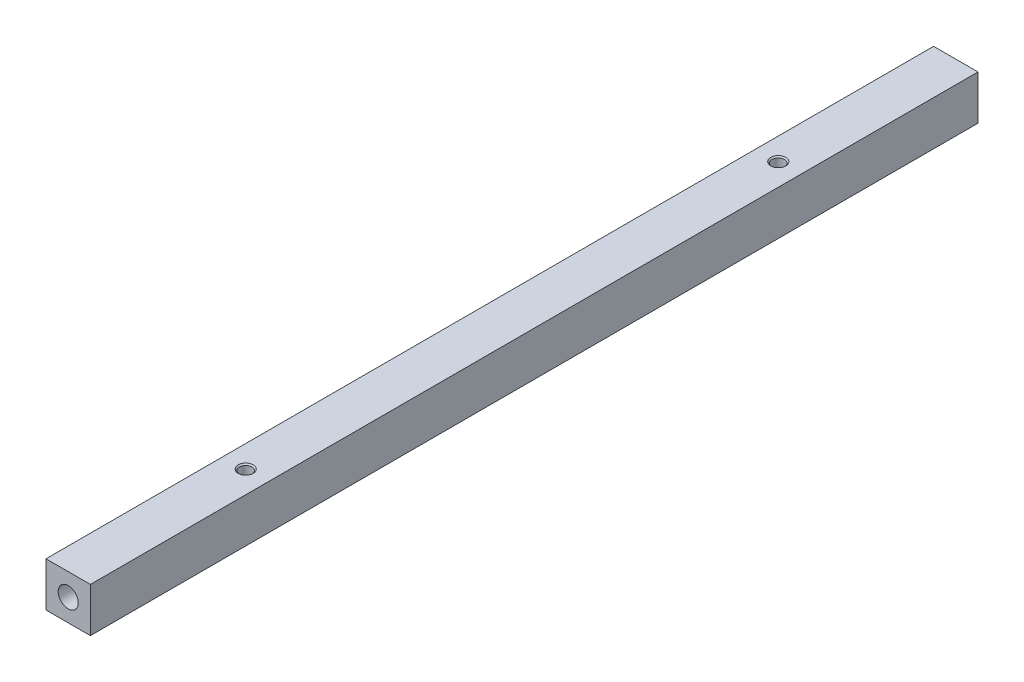
ISO-10303-21;
HEADER;
FILE_DESCRIPTION(('STEP AP214'),'2;1');
FILE_NAME('part.step','',(''),(''),'','','');
FILE_SCHEMA(('AUTOMOTIVE_DESIGN { 1 0 10303 214 1 1 1 1 }'));
ENDSEC;
DATA;
#1=APPLICATION_CONTEXT('core data for automotive mechanical design processes');
#2=APPLICATION_PROTOCOL_DEFINITION('international standard','automotive_design',2000,#1);
#3=PRODUCT_CONTEXT('',#1,'mechanical');
#4=PRODUCT('Part','Part','',(#3));
#5=PRODUCT_RELATED_PRODUCT_CATEGORY('part','',(#4));
#6=PRODUCT_DEFINITION_FORMATION('','',#4);
#7=PRODUCT_DEFINITION_CONTEXT('part definition',#1,'design');
#8=PRODUCT_DEFINITION('design','',#6,#7);
#9=PRODUCT_DEFINITION_SHAPE('','',#8);
#10=(LENGTH_UNIT() NAMED_UNIT(*) SI_UNIT(.MILLI.,.METRE.));
#11=(NAMED_UNIT(*) PLANE_ANGLE_UNIT() SI_UNIT($,.RADIAN.));
#12=(NAMED_UNIT(*) SI_UNIT($,.STERADIAN.) SOLID_ANGLE_UNIT());
#13=UNCERTAINTY_MEASURE_WITH_UNIT(LENGTH_MEASURE(1.E-05),#10,'distance_accuracy_value','');
#14=(GEOMETRIC_REPRESENTATION_CONTEXT(3) GLOBAL_UNCERTAINTY_ASSIGNED_CONTEXT((#13)) GLOBAL_UNIT_ASSIGNED_CONTEXT((#10,
#11,#12)) REPRESENTATION_CONTEXT('',''));
#15=CARTESIAN_POINT('',(0.,0.,0.));
#16=DIRECTION('',(0.,0.,1.));
#17=DIRECTION('',(1.,0.,0.));
#18=AXIS2_PLACEMENT_3D('',#15,#16,#17);
#19=CARTESIAN_POINT('',(7.5,-7.5,150.));
#20=DIRECTION('',(-1.,0.,0.));
#21=DIRECTION('',(0.,0.,1.));
#22=AXIS2_PLACEMENT_3D('',#19,#20,#21);
#23=PLANE('',#22);
#24=DIRECTION('',(0.,1.,0.));
#25=VECTOR('',#24,1.);
#26=CARTESIAN_POINT('',(7.5,-7.5,-150.));
#27=LINE('',#26,#25);
#28=CARTESIAN_POINT('',(7.5,-7.5,-150.));
#29=VERTEX_POINT('',#28);
#30=CARTESIAN_POINT('',(7.5,7.5,-150.));
#31=VERTEX_POINT('',#30);
#32=EDGE_CURVE('E119',#29,#31,#27,.T.);
#33=ORIENTED_EDGE('',*,*,#32,.T.);
#34=DIRECTION('',(0.,0.,-1.));
#35=VECTOR('',#34,1.);
#36=CARTESIAN_POINT('',(7.5,7.5,150.));
#37=LINE('',#36,#35);
#38=CARTESIAN_POINT('',(7.5,7.5,150.));
#39=VERTEX_POINT('',#38);
#40=EDGE_CURVE('E11',#39,#31,#37,.T.);
#41=ORIENTED_EDGE('',*,*,#40,.F.);
#42=DIRECTION('',(0.,1.,0.));
#43=VECTOR('',#42,1.);
#44=CARTESIAN_POINT('',(7.5,-7.5,150.));
#45=LINE('',#44,#43);
#46=CARTESIAN_POINT('',(7.5,-7.5,150.));
#47=VERTEX_POINT('',#46);
#48=EDGE_CURVE('E120',#47,#39,#45,.T.);
#49=ORIENTED_EDGE('',*,*,#48,.F.);
#50=DIRECTION('',(0.,0.,-1.));
#51=VECTOR('',#50,1.);
#52=CARTESIAN_POINT('',(7.5,-7.5,150.));
#53=LINE('',#52,#51);
#54=EDGE_CURVE('E126',#47,#29,#53,.T.);
#55=ORIENTED_EDGE('',*,*,#54,.T.);
#56=EDGE_LOOP('',(#33,#41,#49,#55));
#57=FACE_BOUND('',#56,.T.);
#58=ADVANCED_FACE('F42',(#57),#23,.F.);
#59=CARTESIAN_POINT('',(-7.5,7.5,150.));
#60=DIRECTION('',(0.,-1.,0.));
#61=DIRECTION('',(0.,0.,-1.));
#62=AXIS2_PLACEMENT_3D('',#59,#60,#61);
#63=PLANE('',#62);
#64=CARTESIAN_POINT('',(0.,7.5,90.));
#65=DIRECTION('',(0.,1.,0.));
#66=DIRECTION('',(0.,0.,1.));
#67=AXIS2_PLACEMENT_3D('',#64,#65,#66);
#68=CIRCLE('',#67,2.525);
#69=CARTESIAN_POINT('',(0.,7.5,92.525));
#70=VERTEX_POINT('',#69);
#71=EDGE_CURVE('E171',#70,#70,#68,.T.);
#72=ORIENTED_EDGE('',*,*,#71,.F.);
#73=EDGE_LOOP('',(#72));
#74=FACE_BOUND('',#73,.T.);
#75=CARTESIAN_POINT('',(0.,7.5,-90.));
#76=DIRECTION('',(0.,1.,0.));
#77=DIRECTION('',(0.,0.,1.));
#78=AXIS2_PLACEMENT_3D('',#75,#76,#77);
#79=CIRCLE('',#78,2.525);
#80=CARTESIAN_POINT('',(0.,7.5,-87.475));
#81=VERTEX_POINT('',#80);
#82=EDGE_CURVE('E174',#81,#81,#79,.T.);
#83=ORIENTED_EDGE('',*,*,#82,.F.);
#84=EDGE_LOOP('',(#83));
#85=FACE_BOUND('',#84,.T.);
#86=DIRECTION('',(-1.,0.,0.));
#87=VECTOR('',#86,1.);
#88=CARTESIAN_POINT('',(-7.5,7.5,-150.));
#89=LINE('',#88,#87);
#90=CARTESIAN_POINT('',(-7.5,7.5,-150.));
#91=VERTEX_POINT('',#90);
#92=EDGE_CURVE('E129',#31,#91,#89,.T.);
#93=ORIENTED_EDGE('',*,*,#92,.T.);
#94=DIRECTION('',(0.,0.,-1.));
#95=VECTOR('',#94,1.);
#96=CARTESIAN_POINT('',(-7.5,7.5,150.));
#97=LINE('',#96,#95);
#98=CARTESIAN_POINT('',(-7.5,7.5,150.));
#99=VERTEX_POINT('',#98);
#100=EDGE_CURVE('E50',#99,#91,#97,.T.);
#101=ORIENTED_EDGE('',*,*,#100,.F.);
#102=DIRECTION('',(-1.,0.,0.));
#103=VECTOR('',#102,1.);
#104=CARTESIAN_POINT('',(-7.5,7.5,150.));
#105=LINE('',#104,#103);
#106=EDGE_CURVE('E89',#39,#99,#105,.T.);
#107=ORIENTED_EDGE('',*,*,#106,.F.);
#108=ORIENTED_EDGE('',*,*,#40,.T.);
#109=EDGE_LOOP('',(#93,#101,#107,#108));
#110=FACE_BOUND('',#109,.T.);
#111=ADVANCED_FACE('F156',(#74,#85,#110),#63,.F.);
#112=CARTESIAN_POINT('',(-7.5,-7.5,150.));
#113=DIRECTION('',(1.,0.,0.));
#114=DIRECTION('',(0.,0.,-1.));
#115=AXIS2_PLACEMENT_3D('',#112,#113,#114);
#116=PLANE('',#115);
#117=DIRECTION('',(0.,-1.,0.));
#118=VECTOR('',#117,1.);
#119=CARTESIAN_POINT('',(-7.5,-7.5,-150.));
#120=LINE('',#119,#118);
#121=CARTESIAN_POINT('',(-7.5,-7.5,-150.));
#122=VERTEX_POINT('',#121);
#123=EDGE_CURVE('E76',#91,#122,#120,.T.);
#124=ORIENTED_EDGE('',*,*,#123,.T.);
#125=DIRECTION('',(0.,0.,-1.));
#126=VECTOR('',#125,1.);
#127=CARTESIAN_POINT('',(-7.5,-7.5,150.));
#128=LINE('',#127,#126);
#129=CARTESIAN_POINT('',(-7.5,-7.5,150.));
#130=VERTEX_POINT('',#129);
#131=EDGE_CURVE('E134',#130,#122,#128,.T.);
#132=ORIENTED_EDGE('',*,*,#131,.F.);
#133=DIRECTION('',(0.,-1.,0.));
#134=VECTOR('',#133,1.);
#135=CARTESIAN_POINT('',(-7.5,-7.5,150.));
#136=LINE('',#135,#134);
#137=EDGE_CURVE('E123',#99,#130,#136,.T.);
#138=ORIENTED_EDGE('',*,*,#137,.F.);
#139=ORIENTED_EDGE('',*,*,#100,.T.);
#140=EDGE_LOOP('',(#124,#132,#138,#139));
#141=FACE_BOUND('',#140,.T.);
#142=ADVANCED_FACE('F136',(#141),#116,.F.);
#143=CARTESIAN_POINT('',(-7.5,-7.5,150.));
#144=DIRECTION('',(0.,1.,0.));
#145=DIRECTION('',(0.,0.,1.));
#146=AXIS2_PLACEMENT_3D('',#143,#144,#145);
#147=PLANE('',#146);
#148=CARTESIAN_POINT('',(0.,-7.5,90.));
#149=DIRECTION('',(0.,1.,0.));
#150=DIRECTION('',(0.,0.,1.));
#151=AXIS2_PLACEMENT_3D('',#148,#149,#150);
#152=CIRCLE('',#151,2.1);
#153=CARTESIAN_POINT('',(0.,-7.5,92.1));
#154=VERTEX_POINT('',#153);
#155=EDGE_CURVE('E177',#154,#154,#152,.T.);
#156=ORIENTED_EDGE('',*,*,#155,.T.);
#157=EDGE_LOOP('',(#156));
#158=FACE_BOUND('',#157,.T.);
#159=CARTESIAN_POINT('',(0.,-7.5,-90.));
#160=DIRECTION('',(0.,1.,0.));
#161=DIRECTION('',(0.,0.,1.));
#162=AXIS2_PLACEMENT_3D('',#159,#160,#161);
#163=CIRCLE('',#162,2.1);
#164=CARTESIAN_POINT('',(0.,-7.5,-87.9));
#165=VERTEX_POINT('',#164);
#166=EDGE_CURVE('E113',#165,#165,#163,.T.);
#167=ORIENTED_EDGE('',*,*,#166,.T.);
#168=EDGE_LOOP('',(#167));
#169=FACE_BOUND('',#168,.T.);
#170=DIRECTION('',(1.,0.,0.));
#171=VECTOR('',#170,1.);
#172=CARTESIAN_POINT('',(-7.5,-7.5,-150.));
#173=LINE('',#172,#171);
#174=EDGE_CURVE('E82',#122,#29,#173,.T.);
#175=ORIENTED_EDGE('',*,*,#174,.T.);
#176=ORIENTED_EDGE('',*,*,#54,.F.);
#177=DIRECTION('',(1.,0.,0.));
#178=VECTOR('',#177,1.);
#179=CARTESIAN_POINT('',(-7.5,-7.5,150.));
#180=LINE('',#179,#178);
#181=EDGE_CURVE('E58',#130,#47,#180,.T.);
#182=ORIENTED_EDGE('',*,*,#181,.F.);
#183=ORIENTED_EDGE('',*,*,#131,.T.);
#184=EDGE_LOOP('',(#175,#176,#182,#183));
#185=FACE_BOUND('',#184,.T.);
#186=ADVANCED_FACE('F143',(#158,#169,#185),#147,.F.);
#187=CARTESIAN_POINT('',(0.,0.,150.));
#188=DIRECTION('',(0.,0.,-1.));
#189=DIRECTION('',(-1.,0.,0.));
#190=AXIS2_PLACEMENT_3D('',#187,#188,#189);
#191=PLANE('',#190);
#192=CARTESIAN_POINT('',(0.,0.,150.));
#193=DIRECTION('',(0.,0.,1.));
#194=DIRECTION('',(1.,0.,0.));
#195=AXIS2_PLACEMENT_3D('',#192,#193,#194);
#196=CIRCLE('',#195,3.39999999999999);
#197=CARTESIAN_POINT('',(3.39999999999999,0.,150.));
#198=VERTEX_POINT('',#197);
#199=EDGE_CURVE('E106',#198,#198,#196,.T.);
#200=ORIENTED_EDGE('',*,*,#199,.F.);
#201=EDGE_LOOP('',(#200));
#202=FACE_BOUND('',#201,.T.);
#203=ORIENTED_EDGE('',*,*,#48,.T.);
#204=ORIENTED_EDGE('',*,*,#106,.T.);
#205=ORIENTED_EDGE('',*,*,#137,.T.);
#206=ORIENTED_EDGE('',*,*,#181,.T.);
#207=EDGE_LOOP('',(#203,#204,#205,#206));
#208=FACE_BOUND('',#207,.T.);
#209=ADVANCED_FACE('F145',(#202,#208),#191,.F.);
#210=CARTESIAN_POINT('',(0.,0.,-150.));
#211=DIRECTION('',(0.,0.,-1.));
#212=DIRECTION('',(-1.,0.,0.));
#213=AXIS2_PLACEMENT_3D('',#210,#211,#212);
#214=PLANE('',#213);
#215=CARTESIAN_POINT('',(0.,0.,-150.));
#216=DIRECTION('',(0.,0.,-1.));
#217=DIRECTION('',(-1.,0.,0.));
#218=AXIS2_PLACEMENT_3D('',#215,#216,#217);
#219=CIRCLE('',#218,3.39999999999999);
#220=CARTESIAN_POINT('',(-3.39999999999999,0.,-150.));
#221=VERTEX_POINT('',#220);
#222=EDGE_CURVE('E107',#221,#221,#219,.T.);
#223=ORIENTED_EDGE('',*,*,#222,.F.);
#224=EDGE_LOOP('',(#223));
#225=FACE_BOUND('',#224,.T.);
#226=ORIENTED_EDGE('',*,*,#32,.F.);
#227=ORIENTED_EDGE('',*,*,#174,.F.);
#228=ORIENTED_EDGE('',*,*,#123,.F.);
#229=ORIENTED_EDGE('',*,*,#92,.F.);
#230=EDGE_LOOP('',(#226,#227,#228,#229));
#231=FACE_BOUND('',#230,.T.);
#232=ADVANCED_FACE('F139',(#225,#231),#214,.T.);
#233=CARTESIAN_POINT('',(0.,0.,127.75));
#234=DIRECTION('',(0.,0.,1.));
#235=DIRECTION('',(1.,0.,0.));
#236=AXIS2_PLACEMENT_3D('',#233,#234,#235);
#237=CONICAL_SURFACE('',#236,3.39999999999999,1.02974425867665);
#238=CARTESIAN_POINT('',(0.,0.,125.707073895306));
#239=VERTEX_POINT('',#238);
#240=VERTEX_LOOP('',#239);
#241=FACE_BOUND('',#240,.T.);
#242=CARTESIAN_POINT('',(0.,0.,127.75));
#243=DIRECTION('',(0.,0.,1.));
#244=DIRECTION('',(1.,0.,0.));
#245=AXIS2_PLACEMENT_3D('',#242,#243,#244);
#246=CIRCLE('',#245,3.39999999999999);
#247=CARTESIAN_POINT('',(3.39999999999999,0.,127.75));
#248=VERTEX_POINT('',#247);
#249=EDGE_CURVE('E110',#248,#248,#246,.T.);
#250=ORIENTED_EDGE('',*,*,#249,.T.);
#251=EDGE_LOOP('',(#250));
#252=FACE_BOUND('',#251,.T.);
#253=ADVANCED_FACE('F209',(#241,#252),#237,.F.);
#254=CARTESIAN_POINT('',(0.,0.,150.));
#255=DIRECTION('',(0.,0.,1.));
#256=DIRECTION('',(1.,0.,0.));
#257=AXIS2_PLACEMENT_3D('',#254,#255,#256);
#258=CYLINDRICAL_SURFACE('',#257,3.39999999999999);
#259=ORIENTED_EDGE('',*,*,#249,.F.);
#260=EDGE_LOOP('',(#259));
#261=FACE_BOUND('',#260,.T.);
#262=ORIENTED_EDGE('',*,*,#199,.T.);
#263=EDGE_LOOP('',(#262));
#264=FACE_BOUND('',#263,.T.);
#265=ADVANCED_FACE('F100',(#261,#264),#258,.F.);
#266=CARTESIAN_POINT('',(0.,0.,-127.75));
#267=DIRECTION('',(0.,0.,-1.));
#268=DIRECTION('',(-1.,0.,0.));
#269=AXIS2_PLACEMENT_3D('',#266,#267,#268);
#270=CONICAL_SURFACE('',#269,3.39999999999999,1.02974425867665);
#271=CARTESIAN_POINT('',(0.,0.,-125.707073895306));
#272=VERTEX_POINT('',#271);
#273=VERTEX_LOOP('',#272);
#274=FACE_BOUND('',#273,.T.);
#275=CARTESIAN_POINT('',(0.,0.,-127.75));
#276=DIRECTION('',(0.,0.,-1.));
#277=DIRECTION('',(-1.,0.,0.));
#278=AXIS2_PLACEMENT_3D('',#275,#276,#277);
#279=CIRCLE('',#278,3.39999999999999);
#280=CARTESIAN_POINT('',(-3.39999999999999,0.,-127.75));
#281=VERTEX_POINT('',#280);
#282=EDGE_CURVE('E104',#281,#281,#279,.T.);
#283=ORIENTED_EDGE('',*,*,#282,.T.);
#284=EDGE_LOOP('',(#283));
#285=FACE_BOUND('',#284,.T.);
#286=ADVANCED_FACE('F96',(#274,#285),#270,.F.);
#287=CARTESIAN_POINT('',(0.,0.,-150.));
#288=DIRECTION('',(0.,0.,-1.));
#289=DIRECTION('',(-1.,0.,0.));
#290=AXIS2_PLACEMENT_3D('',#287,#288,#289);
#291=CYLINDRICAL_SURFACE('',#290,3.39999999999999);
#292=ORIENTED_EDGE('',*,*,#282,.F.);
#293=EDGE_LOOP('',(#292));
#294=FACE_BOUND('',#293,.T.);
#295=ORIENTED_EDGE('',*,*,#222,.T.);
#296=EDGE_LOOP('',(#295));
#297=FACE_BOUND('',#296,.T.);
#298=ADVANCED_FACE('F99',(#294,#297),#291,.F.);
#299=CARTESIAN_POINT('',(0.,7.5,-90.));
#300=DIRECTION('',(0.,1.,0.));
#301=DIRECTION('',(0.,0.,1.));
#302=AXIS2_PLACEMENT_3D('',#299,#300,#301);
#303=CYLINDRICAL_SURFACE('',#302,2.1);
#304=ORIENTED_EDGE('',*,*,#166,.F.);
#305=EDGE_LOOP('',(#304));
#306=FACE_BOUND('',#305,.T.);
#307=CARTESIAN_POINT('',(0.,7.075,-90.));
#308=DIRECTION('',(0.,1.,0.));
#309=DIRECTION('',(0.,0.,1.));
#310=AXIS2_PLACEMENT_3D('',#307,#308,#309);
#311=CIRCLE('',#310,2.1);
#312=CARTESIAN_POINT('',(0.,7.075,-87.9));
#313=VERTEX_POINT('',#312);
#314=EDGE_CURVE('E176',#313,#313,#311,.T.);
#315=ORIENTED_EDGE('',*,*,#314,.T.);
#316=EDGE_LOOP('',(#315));
#317=FACE_BOUND('',#316,.T.);
#318=ADVANCED_FACE('F187',(#306,#317),#303,.F.);
#319=CARTESIAN_POINT('',(0.,7.5,-90.));
#320=DIRECTION('',(0.,1.,0.));
#321=DIRECTION('',(0.,0.,1.));
#322=AXIS2_PLACEMENT_3D('',#319,#320,#321);
#323=CONICAL_SURFACE('',#322,2.525,0.785398163397445);
#324=ORIENTED_EDGE('',*,*,#314,.F.);
#325=EDGE_LOOP('',(#324));
#326=FACE_BOUND('',#325,.T.);
#327=ORIENTED_EDGE('',*,*,#82,.T.);
#328=EDGE_LOOP('',(#327));
#329=FACE_BOUND('',#328,.T.);
#330=ADVANCED_FACE('F190',(#326,#329),#323,.F.);
#331=CARTESIAN_POINT('',(0.,7.5,90.));
#332=DIRECTION('',(0.,1.,0.));
#333=DIRECTION('',(0.,0.,1.));
#334=AXIS2_PLACEMENT_3D('',#331,#332,#333);
#335=CYLINDRICAL_SURFACE('',#334,2.1);
#336=ORIENTED_EDGE('',*,*,#155,.F.);
#337=EDGE_LOOP('',(#336));
#338=FACE_BOUND('',#337,.T.);
#339=CARTESIAN_POINT('',(0.,7.075,90.));
#340=DIRECTION('',(0.,1.,0.));
#341=DIRECTION('',(0.,0.,1.));
#342=AXIS2_PLACEMENT_3D('',#339,#340,#341);
#343=CIRCLE('',#342,2.1);
#344=CARTESIAN_POINT('',(0.,7.075,92.1));
#345=VERTEX_POINT('',#344);
#346=EDGE_CURVE('E181',#345,#345,#343,.T.);
#347=ORIENTED_EDGE('',*,*,#346,.T.);
#348=EDGE_LOOP('',(#347));
#349=FACE_BOUND('',#348,.T.);
#350=ADVANCED_FACE('F195',(#338,#349),#335,.F.);
#351=CARTESIAN_POINT('',(0.,7.5,90.));
#352=DIRECTION('',(0.,1.,0.));
#353=DIRECTION('',(0.,0.,1.));
#354=AXIS2_PLACEMENT_3D('',#351,#352,#353);
#355=CONICAL_SURFACE('',#354,2.525,0.785398163397445);
#356=ORIENTED_EDGE('',*,*,#346,.F.);
#357=EDGE_LOOP('',(#356));
#358=FACE_BOUND('',#357,.T.);
#359=ORIENTED_EDGE('',*,*,#71,.T.);
#360=EDGE_LOOP('',(#359));
#361=FACE_BOUND('',#360,.T.);
#362=ADVANCED_FACE('F200',(#358,#361),#355,.F.);
#363=CLOSED_SHELL('',(#58,#111,#142,#186,#209,#232,#253,#265,#286,#298,#318,#330,#350,#362));
#364=MANIFOLD_SOLID_BREP('B2',#363);
#365=ADVANCED_BREP_SHAPE_REPRESENTATION('',(#18,#364),#14);
#366=SHAPE_DEFINITION_REPRESENTATION(#9,#365);
ENDSEC;
END-ISO-10303-21;
